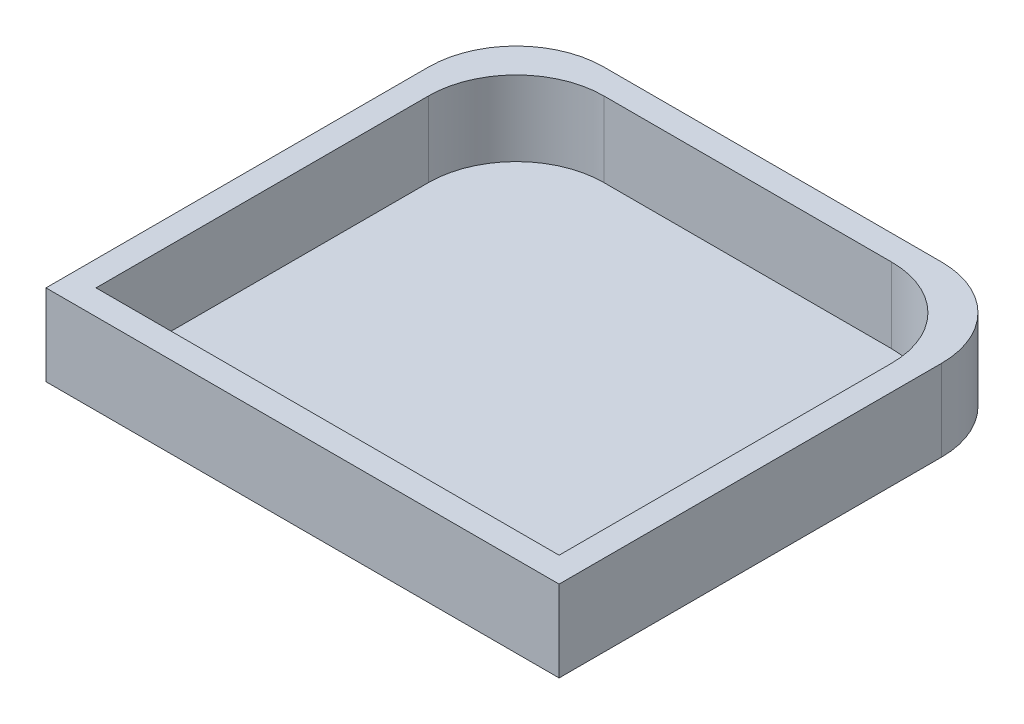
ISO-10303-21;
HEADER;
FILE_DESCRIPTION(('STEP AP214'),'2;1');
FILE_NAME('part.step','',(''),(''),'','','');
FILE_SCHEMA(('AUTOMOTIVE_DESIGN { 1 0 10303 214 1 1 1 1 }'));
ENDSEC;
DATA;
#1=APPLICATION_CONTEXT('core data for automotive mechanical design processes');
#2=APPLICATION_PROTOCOL_DEFINITION('international standard','automotive_design',2000,#1);
#3=PRODUCT_CONTEXT('',#1,'mechanical');
#4=PRODUCT('Part','Part','',(#3));
#5=PRODUCT_RELATED_PRODUCT_CATEGORY('part','',(#4));
#6=PRODUCT_DEFINITION_FORMATION('','',#4);
#7=PRODUCT_DEFINITION_CONTEXT('part definition',#1,'design');
#8=PRODUCT_DEFINITION('design','',#6,#7);
#9=PRODUCT_DEFINITION_SHAPE('','',#8);
#10=(LENGTH_UNIT() NAMED_UNIT(*) SI_UNIT(.MILLI.,.METRE.));
#11=(NAMED_UNIT(*) PLANE_ANGLE_UNIT() SI_UNIT($,.RADIAN.));
#12=(NAMED_UNIT(*) SI_UNIT($,.STERADIAN.) SOLID_ANGLE_UNIT());
#13=UNCERTAINTY_MEASURE_WITH_UNIT(LENGTH_MEASURE(1.E-05),#10,'distance_accuracy_value','');
#14=(GEOMETRIC_REPRESENTATION_CONTEXT(3) GLOBAL_UNCERTAINTY_ASSIGNED_CONTEXT((#13)) GLOBAL_UNIT_ASSIGNED_CONTEXT((#10,
#11,#12)) REPRESENTATION_CONTEXT('',''));
#15=CARTESIAN_POINT('',(0.,0.,0.));
#16=DIRECTION('',(0.,0.,1.));
#17=DIRECTION('',(1.,0.,0.));
#18=AXIS2_PLACEMENT_3D('',#15,#16,#17);
#19=CARTESIAN_POINT('',(-41.015,13.,37.585));
#20=DIRECTION('',(1.,0.,0.));
#21=DIRECTION('',(0.,0.,-1.));
#22=AXIS2_PLACEMENT_3D('',#19,#20,#21);
#23=PLANE('',#22);
#24=DIRECTION('',(0.,0.,1.));
#25=VECTOR('',#24,1.);
#26=CARTESIAN_POINT('',(-41.015,0.,37.585));
#27=LINE('',#26,#25);
#28=CARTESIAN_POINT('',(-41.015,0.,-23.585));
#29=VERTEX_POINT('',#28);
#30=CARTESIAN_POINT('',(-41.015,0.,37.585));
#31=VERTEX_POINT('',#30);
#32=EDGE_CURVE('E134',#29,#31,#27,.T.);
#33=ORIENTED_EDGE('',*,*,#32,.T.);
#34=DIRECTION('',(0.,-1.,0.));
#35=VECTOR('',#34,1.);
#36=CARTESIAN_POINT('',(-41.015,13.,37.585));
#37=LINE('',#36,#35);
#38=CARTESIAN_POINT('',(-41.015,13.,37.585));
#39=VERTEX_POINT('',#38);
#40=EDGE_CURVE('E11',#39,#31,#37,.T.);
#41=ORIENTED_EDGE('',*,*,#40,.F.);
#42=DIRECTION('',(0.,0.,1.));
#43=VECTOR('',#42,1.);
#44=CARTESIAN_POINT('',(-41.015,13.,37.585));
#45=LINE('',#44,#43);
#46=CARTESIAN_POINT('',(-41.015,13.,-23.585));
#47=VERTEX_POINT('',#46);
#48=EDGE_CURVE('E146',#47,#39,#45,.T.);
#49=ORIENTED_EDGE('',*,*,#48,.F.);
#50=DIRECTION('',(0.,-1.,0.));
#51=VECTOR('',#50,1.);
#52=CARTESIAN_POINT('',(-41.015,13.,-23.585));
#53=LINE('',#52,#51);
#54=EDGE_CURVE('E130',#47,#29,#53,.T.);
#55=ORIENTED_EDGE('',*,*,#54,.T.);
#56=EDGE_LOOP('',(#33,#41,#49,#55));
#57=FACE_BOUND('',#56,.T.);
#58=ADVANCED_FACE('F38',(#57),#23,.F.);
#59=CARTESIAN_POINT('',(-41.015,13.,37.585));
#60=DIRECTION('',(0.,0.,-1.));
#61=DIRECTION('',(-1.,0.,0.));
#62=AXIS2_PLACEMENT_3D('',#59,#60,#61);
#63=PLANE('',#62);
#64=DIRECTION('',(1.,0.,0.));
#65=VECTOR('',#64,1.);
#66=CARTESIAN_POINT('',(-41.015,0.,37.585));
#67=LINE('',#66,#65);
#68=CARTESIAN_POINT('',(41.015,0.,37.585));
#69=VERTEX_POINT('',#68);
#70=EDGE_CURVE('E137',#31,#69,#67,.T.);
#71=ORIENTED_EDGE('',*,*,#70,.T.);
#72=DIRECTION('',(0.,-1.,0.));
#73=VECTOR('',#72,1.);
#74=CARTESIAN_POINT('',(41.015,13.,37.585));
#75=LINE('',#74,#73);
#76=CARTESIAN_POINT('',(41.015,13.,37.585));
#77=VERTEX_POINT('',#76);
#78=EDGE_CURVE('E45',#77,#69,#75,.T.);
#79=ORIENTED_EDGE('',*,*,#78,.F.);
#80=DIRECTION('',(1.,0.,0.));
#81=VECTOR('',#80,1.);
#82=CARTESIAN_POINT('',(-41.015,13.,37.585));
#83=LINE('',#82,#81);
#84=EDGE_CURVE('E96',#39,#77,#83,.T.);
#85=ORIENTED_EDGE('',*,*,#84,.F.);
#86=ORIENTED_EDGE('',*,*,#40,.T.);
#87=EDGE_LOOP('',(#71,#79,#85,#86));
#88=FACE_BOUND('',#87,.T.);
#89=ADVANCED_FACE('F268',(#88),#63,.F.);
#90=CARTESIAN_POINT('',(41.015,13.,37.585));
#91=DIRECTION('',(-1.,0.,0.));
#92=DIRECTION('',(0.,0.,1.));
#93=AXIS2_PLACEMENT_3D('',#90,#91,#92);
#94=PLANE('',#93);
#95=DIRECTION('',(0.,0.,-1.));
#96=VECTOR('',#95,1.);
#97=CARTESIAN_POINT('',(41.015,0.,37.585));
#98=LINE('',#97,#96);
#99=CARTESIAN_POINT('',(41.015,0.,-23.585));
#100=VERTEX_POINT('',#99);
#101=EDGE_CURVE('E140',#69,#100,#98,.T.);
#102=ORIENTED_EDGE('',*,*,#101,.T.);
#103=DIRECTION('',(0.,-1.,0.));
#104=VECTOR('',#103,1.);
#105=CARTESIAN_POINT('',(41.015,13.,-23.585));
#106=LINE('',#105,#104);
#107=CARTESIAN_POINT('',(41.015,13.,-23.585));
#108=VERTEX_POINT('',#107);
#109=EDGE_CURVE('E125',#108,#100,#106,.T.);
#110=ORIENTED_EDGE('',*,*,#109,.F.);
#111=DIRECTION('',(0.,0.,-1.));
#112=VECTOR('',#111,1.);
#113=CARTESIAN_POINT('',(41.015,13.,37.585));
#114=LINE('',#113,#112);
#115=EDGE_CURVE('E113',#77,#108,#114,.T.);
#116=ORIENTED_EDGE('',*,*,#115,.F.);
#117=ORIENTED_EDGE('',*,*,#78,.T.);
#118=EDGE_LOOP('',(#102,#110,#116,#117));
#119=FACE_BOUND('',#118,.T.);
#120=ADVANCED_FACE('F152',(#119),#94,.F.);
#121=CARTESIAN_POINT('',(27.015,13.,-23.585));
#122=DIRECTION('',(0.,-1.,0.));
#123=DIRECTION('',(0.,0.,-1.));
#124=AXIS2_PLACEMENT_3D('',#121,#122,#123);
#125=CYLINDRICAL_SURFACE('',#124,14.);
#126=CARTESIAN_POINT('',(27.015,0.,-23.585));
#127=DIRECTION('',(0.,1.,0.));
#128=DIRECTION('',(0.,0.,1.));
#129=AXIS2_PLACEMENT_3D('',#126,#127,#128);
#130=CIRCLE('',#129,14.);
#131=CARTESIAN_POINT('',(27.015,0.,-37.585));
#132=VERTEX_POINT('',#131);
#133=EDGE_CURVE('E122',#100,#132,#130,.T.);
#134=ORIENTED_EDGE('',*,*,#133,.T.);
#135=DIRECTION('',(0.,-1.,0.));
#136=VECTOR('',#135,1.);
#137=CARTESIAN_POINT('',(27.015,13.,-37.585));
#138=LINE('',#137,#136);
#139=CARTESIAN_POINT('',(27.015,13.,-37.585));
#140=VERTEX_POINT('',#139);
#141=EDGE_CURVE('E119',#140,#132,#138,.T.);
#142=ORIENTED_EDGE('',*,*,#141,.F.);
#143=CARTESIAN_POINT('',(27.015,13.,-23.585));
#144=DIRECTION('',(0.,1.,0.));
#145=DIRECTION('',(0.,0.,1.));
#146=AXIS2_PLACEMENT_3D('',#143,#144,#145);
#147=CIRCLE('',#146,14.);
#148=EDGE_CURVE('E106',#108,#140,#147,.T.);
#149=ORIENTED_EDGE('',*,*,#148,.F.);
#150=ORIENTED_EDGE('',*,*,#109,.T.);
#151=EDGE_LOOP('',(#134,#142,#149,#150));
#152=FACE_BOUND('',#151,.T.);
#153=ADVANCED_FACE('F120',(#152),#125,.T.);
#154=CARTESIAN_POINT('',(-27.015,13.,-37.585));
#155=DIRECTION('',(0.,0.,1.));
#156=DIRECTION('',(1.,0.,0.));
#157=AXIS2_PLACEMENT_3D('',#154,#155,#156);
#158=PLANE('',#157);
#159=DIRECTION('',(-1.,0.,0.));
#160=VECTOR('',#159,1.);
#161=CARTESIAN_POINT('',(-27.015,0.,-37.585));
#162=LINE('',#161,#160);
#163=CARTESIAN_POINT('',(-27.015,0.,-37.585));
#164=VERTEX_POINT('',#163);
#165=EDGE_CURVE('E143',#132,#164,#162,.T.);
#166=ORIENTED_EDGE('',*,*,#165,.T.);
#167=DIRECTION('',(0.,-1.,0.));
#168=VECTOR('',#167,1.);
#169=CARTESIAN_POINT('',(-27.015,13.,-37.585));
#170=LINE('',#169,#168);
#171=CARTESIAN_POINT('',(-27.015,13.,-37.585));
#172=VERTEX_POINT('',#171);
#173=EDGE_CURVE('E126',#172,#164,#170,.T.);
#174=ORIENTED_EDGE('',*,*,#173,.F.);
#175=DIRECTION('',(-1.,0.,0.));
#176=VECTOR('',#175,1.);
#177=CARTESIAN_POINT('',(-27.015,13.,-37.585));
#178=LINE('',#177,#176);
#179=EDGE_CURVE('E110',#140,#172,#178,.T.);
#180=ORIENTED_EDGE('',*,*,#179,.F.);
#181=ORIENTED_EDGE('',*,*,#141,.T.);
#182=EDGE_LOOP('',(#166,#174,#180,#181));
#183=FACE_BOUND('',#182,.T.);
#184=ADVANCED_FACE('F128',(#183),#158,.F.);
#185=CARTESIAN_POINT('',(-27.015,13.,-23.585));
#186=DIRECTION('',(0.,-1.,0.));
#187=DIRECTION('',(0.,0.,-1.));
#188=AXIS2_PLACEMENT_3D('',#185,#186,#187);
#189=CYLINDRICAL_SURFACE('',#188,14.);
#190=CARTESIAN_POINT('',(-27.015,0.,-23.585));
#191=DIRECTION('',(0.,1.,0.));
#192=DIRECTION('',(0.,0.,1.));
#193=AXIS2_PLACEMENT_3D('',#190,#191,#192);
#194=CIRCLE('',#193,14.);
#195=EDGE_CURVE('E88',#164,#29,#194,.T.);
#196=ORIENTED_EDGE('',*,*,#195,.T.);
#197=ORIENTED_EDGE('',*,*,#54,.F.);
#198=CARTESIAN_POINT('',(-27.015,13.,-23.585));
#199=DIRECTION('',(0.,1.,0.));
#200=DIRECTION('',(0.,0.,1.));
#201=AXIS2_PLACEMENT_3D('',#198,#199,#200);
#202=CIRCLE('',#201,14.);
#203=EDGE_CURVE('E61',#172,#47,#202,.T.);
#204=ORIENTED_EDGE('',*,*,#203,.F.);
#205=ORIENTED_EDGE('',*,*,#173,.T.);
#206=EDGE_LOOP('',(#196,#197,#204,#205));
#207=FACE_BOUND('',#206,.T.);
#208=ADVANCED_FACE('F156',(#207),#189,.T.);
#209=CARTESIAN_POINT('',(-27.015,13.,-23.585));
#210=DIRECTION('',(0.,1.,0.));
#211=DIRECTION('',(0.,0.,1.));
#212=AXIS2_PLACEMENT_3D('',#209,#210,#211);
#213=PLANE('',#212);
#214=DIRECTION('',(0.,0.,1.));
#215=VECTOR('',#214,1.);
#216=CARTESIAN_POINT('',(-37.015,13.,33.585));
#217=LINE('',#216,#215);
#218=CARTESIAN_POINT('',(-37.015,13.,-19.585));
#219=VERTEX_POINT('',#218);
#220=CARTESIAN_POINT('',(-37.015,13.,33.585));
#221=VERTEX_POINT('',#220);
#222=EDGE_CURVE('E52',#219,#221,#217,.T.);
#223=ORIENTED_EDGE('',*,*,#222,.F.);
#224=CARTESIAN_POINT('',(-23.015,13.,-19.585));
#225=DIRECTION('',(0.,1.,0.));
#226=DIRECTION('',(0.,0.,1.));
#227=AXIS2_PLACEMENT_3D('',#224,#225,#226);
#228=CIRCLE('',#227,14.);
#229=CARTESIAN_POINT('',(-23.015,13.,-33.585));
#230=VERTEX_POINT('',#229);
#231=EDGE_CURVE('E179',#230,#219,#228,.T.);
#232=ORIENTED_EDGE('',*,*,#231,.F.);
#233=DIRECTION('',(-1.,0.,0.));
#234=VECTOR('',#233,1.);
#235=CARTESIAN_POINT('',(-23.015,13.,-33.585));
#236=LINE('',#235,#234);
#237=CARTESIAN_POINT('',(23.015,13.,-33.585));
#238=VERTEX_POINT('',#237);
#239=EDGE_CURVE('E183',#238,#230,#236,.T.);
#240=ORIENTED_EDGE('',*,*,#239,.F.);
#241=CARTESIAN_POINT('',(23.015,13.,-19.585));
#242=DIRECTION('',(0.,1.,0.));
#243=DIRECTION('',(0.,0.,1.));
#244=AXIS2_PLACEMENT_3D('',#241,#242,#243);
#245=CIRCLE('',#244,14.);
#246=CARTESIAN_POINT('',(37.015,13.,-19.585));
#247=VERTEX_POINT('',#246);
#248=EDGE_CURVE('E186',#247,#238,#245,.T.);
#249=ORIENTED_EDGE('',*,*,#248,.F.);
#250=DIRECTION('',(0.,0.,-1.));
#251=VECTOR('',#250,1.);
#252=CARTESIAN_POINT('',(37.015,13.,33.585));
#253=LINE('',#252,#251);
#254=CARTESIAN_POINT('',(37.015,13.,33.585));
#255=VERTEX_POINT('',#254);
#256=EDGE_CURVE('E189',#255,#247,#253,.T.);
#257=ORIENTED_EDGE('',*,*,#256,.F.);
#258=DIRECTION('',(1.,0.,0.));
#259=VECTOR('',#258,1.);
#260=CARTESIAN_POINT('',(-37.015,13.,33.585));
#261=LINE('',#260,#259);
#262=EDGE_CURVE('E192',#221,#255,#261,.T.);
#263=ORIENTED_EDGE('',*,*,#262,.F.);
#264=EDGE_LOOP('',(#223,#232,#240,#249,#257,#263));
#265=FACE_BOUND('',#264,.T.);
#266=ORIENTED_EDGE('',*,*,#48,.T.);
#267=ORIENTED_EDGE('',*,*,#84,.T.);
#268=ORIENTED_EDGE('',*,*,#115,.T.);
#269=ORIENTED_EDGE('',*,*,#148,.T.);
#270=ORIENTED_EDGE('',*,*,#179,.T.);
#271=ORIENTED_EDGE('',*,*,#203,.T.);
#272=EDGE_LOOP('',(#266,#267,#268,#269,#270,#271));
#273=FACE_BOUND('',#272,.T.);
#274=ADVANCED_FACE('F108',(#265,#273),#213,.T.);
#275=CARTESIAN_POINT('',(-27.015,0.,-23.585));
#276=DIRECTION('',(0.,1.,0.));
#277=DIRECTION('',(0.,0.,1.));
#278=AXIS2_PLACEMENT_3D('',#275,#276,#277);
#279=PLANE('',#278);
#280=ORIENTED_EDGE('',*,*,#32,.F.);
#281=ORIENTED_EDGE('',*,*,#195,.F.);
#282=ORIENTED_EDGE('',*,*,#165,.F.);
#283=ORIENTED_EDGE('',*,*,#133,.F.);
#284=ORIENTED_EDGE('',*,*,#101,.F.);
#285=ORIENTED_EDGE('',*,*,#70,.F.);
#286=EDGE_LOOP('',(#280,#281,#282,#283,#284,#285));
#287=FACE_BOUND('',#286,.T.);
#288=ADVANCED_FACE('F155',(#287),#279,.F.);
#289=CARTESIAN_POINT('',(-37.015,0.999999999999999,33.585));
#290=DIRECTION('',(-1.,0.,0.));
#291=DIRECTION('',(0.,0.,1.));
#292=AXIS2_PLACEMENT_3D('',#289,#290,#291);
#293=PLANE('',#292);
#294=ORIENTED_EDGE('',*,*,#222,.T.);
#295=DIRECTION('',(0.,1.,0.));
#296=VECTOR('',#295,1.);
#297=CARTESIAN_POINT('',(-37.015,0.999999999999999,33.585));
#298=LINE('',#297,#296);
#299=CARTESIAN_POINT('',(-37.015,0.999999999999999,33.585));
#300=VERTEX_POINT('',#299);
#301=EDGE_CURVE('E163',#300,#221,#298,.T.);
#302=ORIENTED_EDGE('',*,*,#301,.F.);
#303=DIRECTION('',(0.,0.,1.));
#304=VECTOR('',#303,1.);
#305=CARTESIAN_POINT('',(-37.015,0.999999999999999,33.585));
#306=LINE('',#305,#304);
#307=CARTESIAN_POINT('',(-37.015,0.999999999999999,-19.585));
#308=VERTEX_POINT('',#307);
#309=EDGE_CURVE('E182',#308,#300,#306,.T.);
#310=ORIENTED_EDGE('',*,*,#309,.F.);
#311=DIRECTION('',(0.,1.,0.));
#312=VECTOR('',#311,1.);
#313=CARTESIAN_POINT('',(-37.015,0.999999999999999,-19.585));
#314=LINE('',#313,#312);
#315=EDGE_CURVE('E138',#308,#219,#314,.T.);
#316=ORIENTED_EDGE('',*,*,#315,.T.);
#317=EDGE_LOOP('',(#294,#302,#310,#316));
#318=FACE_BOUND('',#317,.T.);
#319=ADVANCED_FACE('F219',(#318),#293,.F.);
#320=CARTESIAN_POINT('',(-23.015,0.999999999999999,-19.585));
#321=DIRECTION('',(0.,1.,0.));
#322=DIRECTION('',(0.,0.,1.));
#323=AXIS2_PLACEMENT_3D('',#320,#321,#322);
#324=CYLINDRICAL_SURFACE('',#323,14.);
#325=ORIENTED_EDGE('',*,*,#231,.T.);
#326=ORIENTED_EDGE('',*,*,#315,.F.);
#327=CARTESIAN_POINT('',(-23.015,0.999999999999999,-19.585));
#328=DIRECTION('',(0.,1.,0.));
#329=DIRECTION('',(0.,0.,1.));
#330=AXIS2_PLACEMENT_3D('',#327,#328,#329);
#331=CIRCLE('',#330,14.);
#332=CARTESIAN_POINT('',(-23.015,0.999999999999999,-33.585));
#333=VERTEX_POINT('',#332);
#334=EDGE_CURVE('E166',#333,#308,#331,.T.);
#335=ORIENTED_EDGE('',*,*,#334,.F.);
#336=DIRECTION('',(0.,1.,0.));
#337=VECTOR('',#336,1.);
#338=CARTESIAN_POINT('',(-23.015,0.999999999999999,-33.585));
#339=LINE('',#338,#337);
#340=EDGE_CURVE('E175',#333,#230,#339,.T.);
#341=ORIENTED_EDGE('',*,*,#340,.T.);
#342=EDGE_LOOP('',(#325,#326,#335,#341));
#343=FACE_BOUND('',#342,.T.);
#344=ADVANCED_FACE('F235',(#343),#324,.F.);
#345=CARTESIAN_POINT('',(-23.015,0.999999999999999,-33.585));
#346=DIRECTION('',(0.,0.,-1.));
#347=DIRECTION('',(-1.,0.,0.));
#348=AXIS2_PLACEMENT_3D('',#345,#346,#347);
#349=PLANE('',#348);
#350=ORIENTED_EDGE('',*,*,#239,.T.);
#351=ORIENTED_EDGE('',*,*,#340,.F.);
#352=DIRECTION('',(-1.,0.,0.));
#353=VECTOR('',#352,1.);
#354=CARTESIAN_POINT('',(-23.015,0.999999999999999,-33.585));
#355=LINE('',#354,#353);
#356=CARTESIAN_POINT('',(23.015,0.999999999999999,-33.585));
#357=VERTEX_POINT('',#356);
#358=EDGE_CURVE('E198',#357,#333,#355,.T.);
#359=ORIENTED_EDGE('',*,*,#358,.F.);
#360=DIRECTION('',(0.,1.,0.));
#361=VECTOR('',#360,1.);
#362=CARTESIAN_POINT('',(23.015,0.999999999999999,-33.585));
#363=LINE('',#362,#361);
#364=EDGE_CURVE('E172',#357,#238,#363,.T.);
#365=ORIENTED_EDGE('',*,*,#364,.T.);
#366=EDGE_LOOP('',(#350,#351,#359,#365));
#367=FACE_BOUND('',#366,.T.);
#368=ADVANCED_FACE('F240',(#367),#349,.F.);
#369=CARTESIAN_POINT('',(23.015,0.999999999999999,-19.585));
#370=DIRECTION('',(0.,1.,0.));
#371=DIRECTION('',(0.,0.,1.));
#372=AXIS2_PLACEMENT_3D('',#369,#370,#371);
#373=CYLINDRICAL_SURFACE('',#372,14.);
#374=ORIENTED_EDGE('',*,*,#248,.T.);
#375=ORIENTED_EDGE('',*,*,#364,.F.);
#376=CARTESIAN_POINT('',(23.015,0.999999999999999,-19.585));
#377=DIRECTION('',(0.,1.,0.));
#378=DIRECTION('',(0.,0.,1.));
#379=AXIS2_PLACEMENT_3D('',#376,#377,#378);
#380=CIRCLE('',#379,14.);
#381=CARTESIAN_POINT('',(37.015,0.999999999999999,-19.585));
#382=VERTEX_POINT('',#381);
#383=EDGE_CURVE('E201',#382,#357,#380,.T.);
#384=ORIENTED_EDGE('',*,*,#383,.F.);
#385=DIRECTION('',(0.,1.,0.));
#386=VECTOR('',#385,1.);
#387=CARTESIAN_POINT('',(37.015,0.999999999999999,-19.585));
#388=LINE('',#387,#386);
#389=EDGE_CURVE('E169',#382,#247,#388,.T.);
#390=ORIENTED_EDGE('',*,*,#389,.T.);
#391=EDGE_LOOP('',(#374,#375,#384,#390));
#392=FACE_BOUND('',#391,.T.);
#393=ADVANCED_FACE('F258',(#392),#373,.F.);
#394=CARTESIAN_POINT('',(37.015,0.999999999999999,33.585));
#395=DIRECTION('',(1.,0.,0.));
#396=DIRECTION('',(0.,0.,-1.));
#397=AXIS2_PLACEMENT_3D('',#394,#395,#396);
#398=PLANE('',#397);
#399=ORIENTED_EDGE('',*,*,#256,.T.);
#400=ORIENTED_EDGE('',*,*,#389,.F.);
#401=DIRECTION('',(0.,0.,-1.));
#402=VECTOR('',#401,1.);
#403=CARTESIAN_POINT('',(37.015,0.999999999999999,33.585));
#404=LINE('',#403,#402);
#405=CARTESIAN_POINT('',(37.015,0.999999999999999,33.585));
#406=VERTEX_POINT('',#405);
#407=EDGE_CURVE('E204',#406,#382,#404,.T.);
#408=ORIENTED_EDGE('',*,*,#407,.F.);
#409=DIRECTION('',(0.,1.,0.));
#410=VECTOR('',#409,1.);
#411=CARTESIAN_POINT('',(37.015,0.999999999999999,33.585));
#412=LINE('',#411,#410);
#413=EDGE_CURVE('E165',#406,#255,#412,.T.);
#414=ORIENTED_EDGE('',*,*,#413,.T.);
#415=EDGE_LOOP('',(#399,#400,#408,#414));
#416=FACE_BOUND('',#415,.T.);
#417=ADVANCED_FACE('F254',(#416),#398,.F.);
#418=CARTESIAN_POINT('',(-37.015,0.999999999999999,33.585));
#419=DIRECTION('',(0.,0.,1.));
#420=DIRECTION('',(1.,0.,0.));
#421=AXIS2_PLACEMENT_3D('',#418,#419,#420);
#422=PLANE('',#421);
#423=ORIENTED_EDGE('',*,*,#262,.T.);
#424=ORIENTED_EDGE('',*,*,#413,.F.);
#425=DIRECTION('',(1.,0.,0.));
#426=VECTOR('',#425,1.);
#427=CARTESIAN_POINT('',(-37.015,0.999999999999999,33.585));
#428=LINE('',#427,#426);
#429=EDGE_CURVE('E207',#300,#406,#428,.T.);
#430=ORIENTED_EDGE('',*,*,#429,.F.);
#431=ORIENTED_EDGE('',*,*,#301,.T.);
#432=EDGE_LOOP('',(#423,#424,#430,#431));
#433=FACE_BOUND('',#432,.T.);
#434=ADVANCED_FACE('F248',(#433),#422,.F.);
#435=CARTESIAN_POINT('',(-23.015,0.999999999999999,-19.585));
#436=DIRECTION('',(0.,1.,0.));
#437=DIRECTION('',(0.,0.,1.));
#438=AXIS2_PLACEMENT_3D('',#435,#436,#437);
#439=PLANE('',#438);
#440=ORIENTED_EDGE('',*,*,#309,.T.);
#441=ORIENTED_EDGE('',*,*,#429,.T.);
#442=ORIENTED_EDGE('',*,*,#407,.T.);
#443=ORIENTED_EDGE('',*,*,#383,.T.);
#444=ORIENTED_EDGE('',*,*,#358,.T.);
#445=ORIENTED_EDGE('',*,*,#334,.T.);
#446=EDGE_LOOP('',(#440,#441,#442,#443,#444,#445));
#447=FACE_BOUND('',#446,.T.);
#448=ADVANCED_FACE('F214',(#447),#439,.T.);
#449=CLOSED_SHELL('',(#58,#89,#120,#153,#184,#208,#274,#288,#319,#344,#368,#393,#417,#434,#448));
#450=MANIFOLD_SOLID_BREP('B2',#449);
#451=ADVANCED_BREP_SHAPE_REPRESENTATION('',(#18,#450),#14);
#452=SHAPE_DEFINITION_REPRESENTATION(#9,#451);
ENDSEC;
END-ISO-10303-21;
